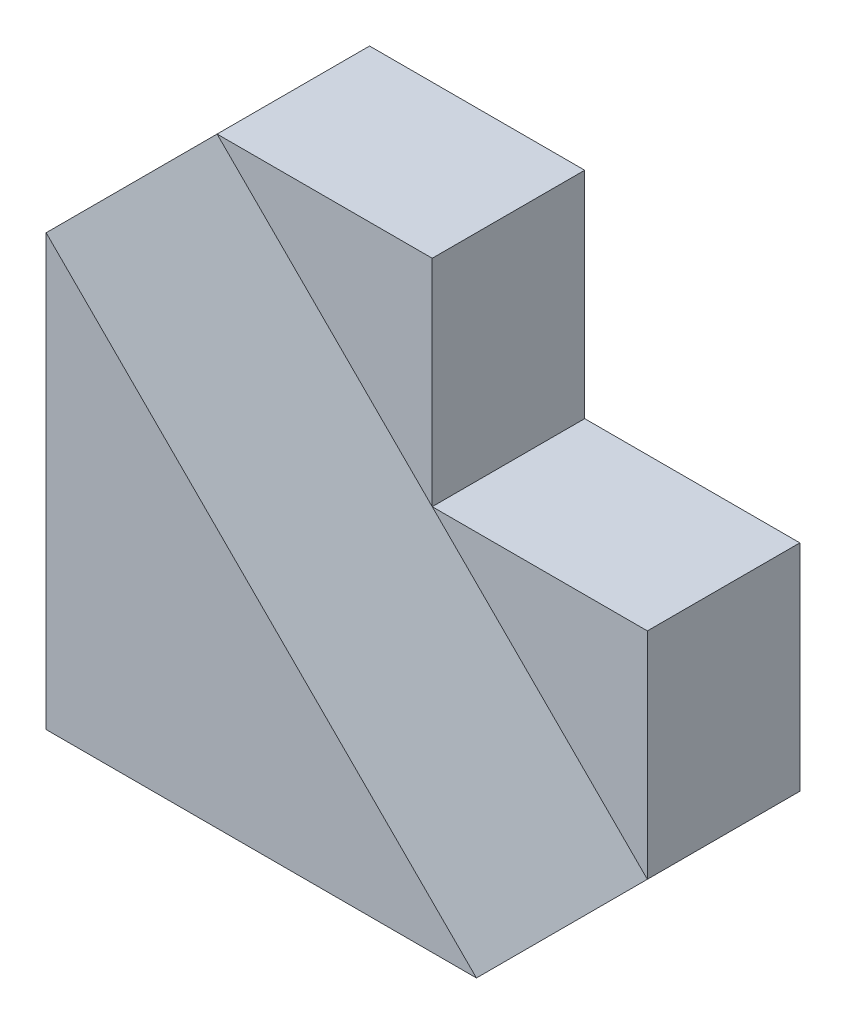
ISO-10303-21;
HEADER;
FILE_DESCRIPTION(('STEP AP214'),'2;1');
FILE_NAME('part.step','',(''),(''),'','','');
FILE_SCHEMA(('AUTOMOTIVE_DESIGN { 1 0 10303 214 1 1 1 1 }'));
ENDSEC;
DATA;
#1=APPLICATION_CONTEXT('core data for automotive mechanical design processes');
#2=APPLICATION_PROTOCOL_DEFINITION('international standard','automotive_design',2000,#1);
#3=PRODUCT_CONTEXT('',#1,'mechanical');
#4=PRODUCT('Part','Part','',(#3));
#5=PRODUCT_RELATED_PRODUCT_CATEGORY('part','',(#4));
#6=PRODUCT_DEFINITION_FORMATION('','',#4);
#7=PRODUCT_DEFINITION_CONTEXT('part definition',#1,'design');
#8=PRODUCT_DEFINITION('design','',#6,#7);
#9=PRODUCT_DEFINITION_SHAPE('','',#8);
#10=(LENGTH_UNIT() NAMED_UNIT(*) SI_UNIT(.MILLI.,.METRE.));
#11=(NAMED_UNIT(*) PLANE_ANGLE_UNIT() SI_UNIT($,.RADIAN.));
#12=(NAMED_UNIT(*) SI_UNIT($,.STERADIAN.) SOLID_ANGLE_UNIT());
#13=UNCERTAINTY_MEASURE_WITH_UNIT(LENGTH_MEASURE(1.E-05),#10,'distance_accuracy_value','');
#14=(GEOMETRIC_REPRESENTATION_CONTEXT(3) GLOBAL_UNCERTAINTY_ASSIGNED_CONTEXT((#13)) GLOBAL_UNIT_ASSIGNED_CONTEXT((#10,
#11,#12)) REPRESENTATION_CONTEXT('',''));
#15=CARTESIAN_POINT('',(0.,0.,0.));
#16=DIRECTION('',(0.,0.,1.));
#17=DIRECTION('',(1.,0.,0.));
#18=AXIS2_PLACEMENT_3D('',#15,#16,#17);
#19=CARTESIAN_POINT('',(28.7549407114625,-14.4268774703557,37.5812132438192));
#20=DIRECTION('',(-0.707106781186547,-0.707106781186548,0.));
#21=DIRECTION('',(0.707106781186548,-0.707106781186547,0.));
#22=AXIS2_PLACEMENT_3D('',#19,#20,#21);
#23=PLANE('',#22);
#24=DIRECTION('',(0.,0.,-1.));
#25=VECTOR('',#24,1.);
#26=CARTESIAN_POINT('',(28.7549407114625,-14.4268774703557,37.5812132438192));
#27=LINE('',#26,#25);
#28=CARTESIAN_POINT('',(28.7549407114625,-14.4268774703557,37.5812132438192));
#29=VERTEX_POINT('',#28);
#30=CARTESIAN_POINT('',(28.7549407114625,-14.4268774703557,17.7187242404792));
#31=VERTEX_POINT('',#30);
#32=EDGE_CURVE('E119',#29,#31,#27,.T.);
#33=ORIENTED_EDGE('',*,*,#32,.T.);
#34=DIRECTION('',(-0.707106781186548,0.707106781186548,0.));
#35=VECTOR('',#34,1.);
#36=CARTESIAN_POINT('',(7.16403162055336,7.16403162055336,17.7187242404792));
#37=LINE('',#36,#35);
#38=CARTESIAN_POINT('',(3.75494071146245,10.5731225296443,17.7187242404792));
#39=VERTEX_POINT('',#38);
#40=EDGE_CURVE('E134',#31,#39,#37,.T.);
#41=ORIENTED_EDGE('',*,*,#40,.T.);
#42=DIRECTION('',(-0.707106781186548,0.707106781186548,0.));
#43=VECTOR('',#42,1.);
#44=CARTESIAN_POINT('',(7.16403162055336,7.16403162055336,17.7187242404792));
#45=LINE('',#44,#43);
#46=CARTESIAN_POINT('',(-21.2450592885376,35.5731225296443,17.7187242404792));
#47=VERTEX_POINT('',#46);
#48=EDGE_CURVE('E131',#39,#47,#45,.T.);
#49=ORIENTED_EDGE('',*,*,#48,.T.);
#50=DIRECTION('',(0.,0.,-1.));
#51=VECTOR('',#50,1.);
#52=CARTESIAN_POINT('',(-21.2450592885376,35.5731225296443,37.5812132438192));
#53=LINE('',#52,#51);
#54=CARTESIAN_POINT('',(-21.2450592885376,35.5731225296443,37.5812132438192));
#55=VERTEX_POINT('',#54);
#56=EDGE_CURVE('E11',#55,#47,#53,.T.);
#57=ORIENTED_EDGE('',*,*,#56,.F.);
#58=DIRECTION('',(-0.707106781186548,0.707106781186547,0.));
#59=VECTOR('',#58,1.);
#60=CARTESIAN_POINT('',(28.7549407114625,-14.4268774703557,37.5812132438192));
#61=LINE('',#60,#59);
#62=EDGE_CURVE('E113',#29,#55,#61,.T.);
#63=ORIENTED_EDGE('',*,*,#62,.F.);
#64=EDGE_LOOP('',(#33,#41,#49,#57,#63));
#65=FACE_BOUND('',#64,.T.);
#66=ADVANCED_FACE('F35',(#65),#23,.F.);
#67=CARTESIAN_POINT('',(-21.2450592885376,35.5731225296443,37.5812132438192));
#68=DIRECTION('',(1.,0.,0.));
#69=DIRECTION('',(0.,1.,0.));
#70=AXIS2_PLACEMENT_3D('',#67,#68,#69);
#71=PLANE('',#70);
#72=DIRECTION('',(0.,-1.,0.));
#73=VECTOR('',#72,1.);
#74=CARTESIAN_POINT('',(-21.2450592885376,35.5731225296443,0.));
#75=LINE('',#74,#73);
#76=CARTESIAN_POINT('',(-21.2450592885376,35.5731225296443,0.));
#77=VERTEX_POINT('',#76);
#78=CARTESIAN_POINT('',(-21.2450592885376,-14.4268774703557,0.));
#79=VERTEX_POINT('',#78);
#80=EDGE_CURVE('E70',#77,#79,#75,.T.);
#81=ORIENTED_EDGE('',*,*,#80,.T.);
#82=DIRECTION('',(0.,0.,-1.));
#83=VECTOR('',#82,1.);
#84=CARTESIAN_POINT('',(-21.2450592885376,-14.4268774703557,37.5812132438192));
#85=LINE('',#84,#83);
#86=CARTESIAN_POINT('',(-21.2450592885376,-14.4268774703557,37.5812132438192));
#87=VERTEX_POINT('',#86);
#88=EDGE_CURVE('E42',#87,#79,#85,.T.);
#89=ORIENTED_EDGE('',*,*,#88,.F.);
#90=DIRECTION('',(0.,-1.,0.));
#91=VECTOR('',#90,1.);
#92=CARTESIAN_POINT('',(-21.2450592885376,35.5731225296443,37.5812132438192));
#93=LINE('',#92,#91);
#94=EDGE_CURVE('E125',#55,#87,#93,.T.);
#95=ORIENTED_EDGE('',*,*,#94,.F.);
#96=ORIENTED_EDGE('',*,*,#56,.T.);
#97=DIRECTION('',(0.,0.,-1.));
#98=VECTOR('',#97,1.);
#99=CARTESIAN_POINT('',(-21.2450592885376,35.5731225296443,17.7187242404792));
#100=LINE('',#99,#98);
#101=EDGE_CURVE('E96',#47,#77,#100,.T.);
#102=ORIENTED_EDGE('',*,*,#101,.T.);
#103=EDGE_LOOP('',(#81,#89,#95,#96,#102));
#104=FACE_BOUND('',#103,.T.);
#105=ADVANCED_FACE('F103',(#104),#71,.F.);
#106=CARTESIAN_POINT('',(-21.2450592885376,-14.4268774703557,37.5812132438192));
#107=DIRECTION('',(0.,1.,0.));
#108=DIRECTION('',(0.,0.,1.));
#109=AXIS2_PLACEMENT_3D('',#106,#107,#108);
#110=PLANE('',#109);
#111=DIRECTION('',(1.,0.,0.));
#112=VECTOR('',#111,1.);
#113=CARTESIAN_POINT('',(-21.2450592885376,-14.4268774703557,0.));
#114=LINE('',#113,#112);
#115=CARTESIAN_POINT('',(28.7549407114625,-14.4268774703557,0.));
#116=VERTEX_POINT('',#115);
#117=EDGE_CURVE('E111',#79,#116,#114,.T.);
#118=ORIENTED_EDGE('',*,*,#117,.T.);
#119=DIRECTION('',(0.,0.,-1.));
#120=VECTOR('',#119,1.);
#121=CARTESIAN_POINT('',(28.7549407114625,-14.4268774703557,17.7187242404792));
#122=LINE('',#121,#120);
#123=EDGE_CURVE('E148',#31,#116,#122,.T.);
#124=ORIENTED_EDGE('',*,*,#123,.F.);
#125=ORIENTED_EDGE('',*,*,#32,.F.);
#126=DIRECTION('',(1.,0.,0.));
#127=VECTOR('',#126,1.);
#128=CARTESIAN_POINT('',(-21.2450592885376,-14.4268774703557,37.5812132438192));
#129=LINE('',#128,#127);
#130=EDGE_CURVE('E58',#87,#29,#129,.T.);
#131=ORIENTED_EDGE('',*,*,#130,.F.);
#132=ORIENTED_EDGE('',*,*,#88,.T.);
#133=EDGE_LOOP('',(#118,#124,#125,#131,#132));
#134=FACE_BOUND('',#133,.T.);
#135=ADVANCED_FACE('F122',(#134),#110,.F.);
#136=CARTESIAN_POINT('',(0.,0.,37.5812132438192));
#137=DIRECTION('',(0.,0.,1.));
#138=DIRECTION('',(1.,0.,0.));
#139=AXIS2_PLACEMENT_3D('',#136,#137,#138);
#140=PLANE('',#139);
#141=ORIENTED_EDGE('',*,*,#62,.T.);
#142=ORIENTED_EDGE('',*,*,#94,.T.);
#143=ORIENTED_EDGE('',*,*,#130,.T.);
#144=EDGE_LOOP('',(#141,#142,#143));
#145=FACE_BOUND('',#144,.T.);
#146=ADVANCED_FACE('F127',(#145),#140,.T.);
#147=CARTESIAN_POINT('',(0.,0.,0.));
#148=DIRECTION('',(0.,0.,1.));
#149=DIRECTION('',(1.,0.,0.));
#150=AXIS2_PLACEMENT_3D('',#147,#148,#149);
#151=PLANE('',#150);
#152=DIRECTION('',(0.,-1.,0.));
#153=VECTOR('',#152,1.);
#154=CARTESIAN_POINT('',(3.75494071146245,0.,0.));
#155=LINE('',#154,#153);
#156=CARTESIAN_POINT('',(3.75494071146245,35.5731225296443,0.));
#157=VERTEX_POINT('',#156);
#158=CARTESIAN_POINT('',(3.75494071146245,10.5731225296443,0.));
#159=VERTEX_POINT('',#158);
#160=EDGE_CURVE('E101',#157,#159,#155,.T.);
#161=ORIENTED_EDGE('',*,*,#160,.T.);
#162=DIRECTION('',(1.,0.,0.));
#163=VECTOR('',#162,1.);
#164=CARTESIAN_POINT('',(0.,10.5731225296443,0.));
#165=LINE('',#164,#163);
#166=CARTESIAN_POINT('',(28.7549407114625,10.5731225296443,0.));
#167=VERTEX_POINT('',#166);
#168=EDGE_CURVE('E141',#159,#167,#165,.T.);
#169=ORIENTED_EDGE('',*,*,#168,.T.);
#170=DIRECTION('',(0.,-1.,0.));
#171=VECTOR('',#170,1.);
#172=CARTESIAN_POINT('',(28.7549407114625,0.,0.));
#173=LINE('',#172,#171);
#174=EDGE_CURVE('E143',#167,#116,#173,.T.);
#175=ORIENTED_EDGE('',*,*,#174,.T.);
#176=ORIENTED_EDGE('',*,*,#117,.F.);
#177=ORIENTED_EDGE('',*,*,#80,.F.);
#178=DIRECTION('',(1.,0.,0.));
#179=VECTOR('',#178,1.);
#180=CARTESIAN_POINT('',(0.,35.5731225296443,0.));
#181=LINE('',#180,#179);
#182=EDGE_CURVE('E94',#77,#157,#181,.T.);
#183=ORIENTED_EDGE('',*,*,#182,.T.);
#184=EDGE_LOOP('',(#161,#169,#175,#176,#177,#183));
#185=FACE_BOUND('',#184,.T.);
#186=ADVANCED_FACE('F108',(#185),#151,.F.);
#187=CARTESIAN_POINT('',(3.75494071146245,0.,17.7187242404792));
#188=DIRECTION('',(1.,0.,0.));
#189=DIRECTION('',(0.,0.,-1.));
#190=AXIS2_PLACEMENT_3D('',#187,#188,#189);
#191=PLANE('',#190);
#192=ORIENTED_EDGE('',*,*,#160,.F.);
#193=DIRECTION('',(0.,0.,-1.));
#194=VECTOR('',#193,1.);
#195=CARTESIAN_POINT('',(3.75494071146245,35.5731225296443,17.7187242404792));
#196=LINE('',#195,#194);
#197=CARTESIAN_POINT('',(3.75494071146245,35.5731225296443,17.7187242404792));
#198=VERTEX_POINT('',#197);
#199=EDGE_CURVE('E80',#198,#157,#196,.T.);
#200=ORIENTED_EDGE('',*,*,#199,.F.);
#201=DIRECTION('',(0.,-1.,0.));
#202=VECTOR('',#201,1.);
#203=CARTESIAN_POINT('',(3.75494071146245,0.,17.7187242404792));
#204=LINE('',#203,#202);
#205=EDGE_CURVE('E100',#198,#39,#204,.T.);
#206=ORIENTED_EDGE('',*,*,#205,.T.);
#207=DIRECTION('',(0.,0.,-1.));
#208=VECTOR('',#207,1.);
#209=CARTESIAN_POINT('',(3.75494071146245,10.5731225296443,17.7187242404792));
#210=LINE('',#209,#208);
#211=EDGE_CURVE('E105',#39,#159,#210,.T.);
#212=ORIENTED_EDGE('',*,*,#211,.T.);
#213=EDGE_LOOP('',(#192,#200,#206,#212));
#214=FACE_BOUND('',#213,.T.);
#215=ADVANCED_FACE('F158',(#214),#191,.T.);
#216=CARTESIAN_POINT('',(0.,35.5731225296443,17.7187242404792));
#217=DIRECTION('',(0.,1.,0.));
#218=DIRECTION('',(0.,0.,1.));
#219=AXIS2_PLACEMENT_3D('',#216,#217,#218);
#220=PLANE('',#219);
#221=ORIENTED_EDGE('',*,*,#182,.F.);
#222=ORIENTED_EDGE('',*,*,#101,.F.);
#223=DIRECTION('',(1.,0.,0.));
#224=VECTOR('',#223,1.);
#225=CARTESIAN_POINT('',(0.,35.5731225296443,17.7187242404792));
#226=LINE('',#225,#224);
#227=EDGE_CURVE('E49',#47,#198,#226,.T.);
#228=ORIENTED_EDGE('',*,*,#227,.T.);
#229=ORIENTED_EDGE('',*,*,#199,.T.);
#230=EDGE_LOOP('',(#221,#222,#228,#229));
#231=FACE_BOUND('',#230,.T.);
#232=ADVANCED_FACE('F95',(#231),#220,.T.);
#233=CARTESIAN_POINT('',(0.,0.,17.7187242404792));
#234=DIRECTION('',(0.,0.,1.));
#235=DIRECTION('',(1.,0.,0.));
#236=AXIS2_PLACEMENT_3D('',#233,#234,#235);
#237=PLANE('',#236);
#238=ORIENTED_EDGE('',*,*,#205,.F.);
#239=ORIENTED_EDGE('',*,*,#227,.F.);
#240=ORIENTED_EDGE('',*,*,#48,.F.);
#241=EDGE_LOOP('',(#238,#239,#240));
#242=FACE_BOUND('',#241,.T.);
#243=ADVANCED_FACE('F160',(#242),#237,.T.);
#244=CARTESIAN_POINT('',(28.7549407114625,0.,17.7187242404792));
#245=DIRECTION('',(1.,0.,0.));
#246=DIRECTION('',(0.,0.,-1.));
#247=AXIS2_PLACEMENT_3D('',#244,#245,#246);
#248=PLANE('',#247);
#249=ORIENTED_EDGE('',*,*,#174,.F.);
#250=DIRECTION('',(0.,0.,-1.));
#251=VECTOR('',#250,1.);
#252=CARTESIAN_POINT('',(28.7549407114625,10.5731225296443,17.7187242404792));
#253=LINE('',#252,#251);
#254=CARTESIAN_POINT('',(28.7549407114625,10.5731225296443,17.7187242404792));
#255=VERTEX_POINT('',#254);
#256=EDGE_CURVE('E152',#255,#167,#253,.T.);
#257=ORIENTED_EDGE('',*,*,#256,.F.);
#258=DIRECTION('',(0.,-1.,0.));
#259=VECTOR('',#258,1.);
#260=CARTESIAN_POINT('',(28.7549407114625,0.,17.7187242404792));
#261=LINE('',#260,#259);
#262=EDGE_CURVE('E156',#255,#31,#261,.T.);
#263=ORIENTED_EDGE('',*,*,#262,.T.);
#264=ORIENTED_EDGE('',*,*,#123,.T.);
#265=EDGE_LOOP('',(#249,#257,#263,#264));
#266=FACE_BOUND('',#265,.T.);
#267=ADVANCED_FACE('F162',(#266),#248,.T.);
#268=CARTESIAN_POINT('',(0.,10.5731225296443,17.7187242404792));
#269=DIRECTION('',(0.,1.,0.));
#270=DIRECTION('',(-1.,0.,0.));
#271=AXIS2_PLACEMENT_3D('',#268,#269,#270);
#272=PLANE('',#271);
#273=ORIENTED_EDGE('',*,*,#168,.F.);
#274=ORIENTED_EDGE('',*,*,#211,.F.);
#275=DIRECTION('',(1.,0.,0.));
#276=VECTOR('',#275,1.);
#277=CARTESIAN_POINT('',(0.,10.5731225296443,17.7187242404792));
#278=LINE('',#277,#276);
#279=EDGE_CURVE('E153',#39,#255,#278,.T.);
#280=ORIENTED_EDGE('',*,*,#279,.T.);
#281=ORIENTED_EDGE('',*,*,#256,.T.);
#282=EDGE_LOOP('',(#273,#274,#280,#281));
#283=FACE_BOUND('',#282,.T.);
#284=ADVANCED_FACE('F168',(#283),#272,.T.);
#285=CARTESIAN_POINT('',(0.,0.,17.7187242404792));
#286=DIRECTION('',(0.,0.,1.));
#287=DIRECTION('',(1.,0.,0.));
#288=AXIS2_PLACEMENT_3D('',#285,#286,#287);
#289=PLANE('',#288);
#290=ORIENTED_EDGE('',*,*,#262,.F.);
#291=ORIENTED_EDGE('',*,*,#279,.F.);
#292=ORIENTED_EDGE('',*,*,#40,.F.);
#293=EDGE_LOOP('',(#290,#291,#292));
#294=FACE_BOUND('',#293,.T.);
#295=ADVANCED_FACE('F214',(#294),#289,.T.);
#296=CLOSED_SHELL('',(#66,#105,#135,#146,#186,#215,#232,#243,#267,#284,#295));
#297=MANIFOLD_SOLID_BREP('B2',#296);
#298=ADVANCED_BREP_SHAPE_REPRESENTATION('',(#18,#297),#14);
#299=SHAPE_DEFINITION_REPRESENTATION(#9,#298);
ENDSEC;
END-ISO-10303-21;
